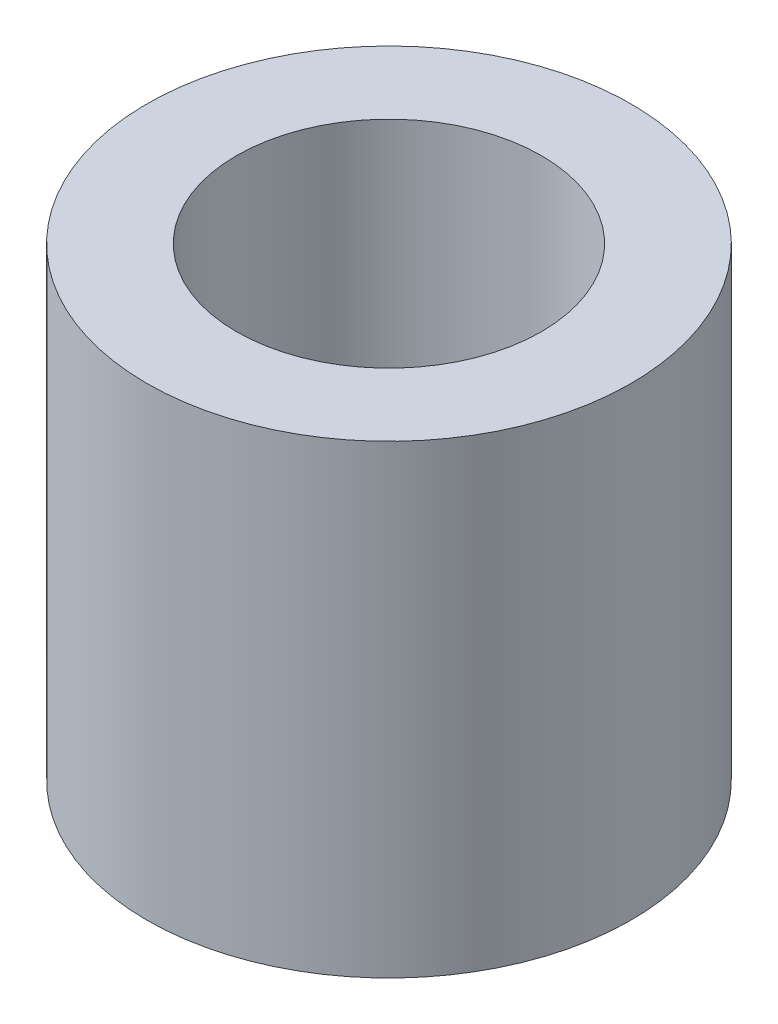
ISO-10303-21;
HEADER;
FILE_DESCRIPTION(('STEP AP214'),'2;1');
FILE_NAME('part.step','',(''),(''),'','','');
FILE_SCHEMA(('AUTOMOTIVE_DESIGN { 1 0 10303 214 1 1 1 1 }'));
ENDSEC;
DATA;
#1=APPLICATION_CONTEXT('core data for automotive mechanical design processes');
#2=APPLICATION_PROTOCOL_DEFINITION('international standard','automotive_design',2000,#1);
#3=PRODUCT_CONTEXT('',#1,'mechanical');
#4=PRODUCT('Part','Part','',(#3));
#5=PRODUCT_RELATED_PRODUCT_CATEGORY('part','',(#4));
#6=PRODUCT_DEFINITION_FORMATION('','',#4);
#7=PRODUCT_DEFINITION_CONTEXT('part definition',#1,'design');
#8=PRODUCT_DEFINITION('design','',#6,#7);
#9=PRODUCT_DEFINITION_SHAPE('','',#8);
#10=(LENGTH_UNIT() NAMED_UNIT(*) SI_UNIT(.MILLI.,.METRE.));
#11=(NAMED_UNIT(*) PLANE_ANGLE_UNIT() SI_UNIT($,.RADIAN.));
#12=(NAMED_UNIT(*) SI_UNIT($,.STERADIAN.) SOLID_ANGLE_UNIT());
#13=UNCERTAINTY_MEASURE_WITH_UNIT(LENGTH_MEASURE(1.E-05),#10,'distance_accuracy_value','');
#14=(GEOMETRIC_REPRESENTATION_CONTEXT(3) GLOBAL_UNCERTAINTY_ASSIGNED_CONTEXT((#13)) GLOBAL_UNIT_ASSIGNED_CONTEXT((#10,
#11,#12)) REPRESENTATION_CONTEXT('',''));
#15=CARTESIAN_POINT('',(0.,0.,0.));
#16=DIRECTION('',(0.,0.,1.));
#17=DIRECTION('',(1.,0.,0.));
#18=AXIS2_PLACEMENT_3D('',#15,#16,#17);
#19=CARTESIAN_POINT('',(0.,-6.096,0.));
#20=DIRECTION('',(0.,1.,0.));
#21=DIRECTION('',(0.,0.,1.));
#22=AXIS2_PLACEMENT_3D('',#19,#20,#21);
#23=CYLINDRICAL_SURFACE('',#22,3.175);
#24=CARTESIAN_POINT('',(0.,-6.096,0.));
#25=DIRECTION('',(0.,1.,0.));
#26=DIRECTION('',(0.,0.,1.));
#27=AXIS2_PLACEMENT_3D('',#24,#25,#26);
#28=CIRCLE('',#27,3.175);
#29=CARTESIAN_POINT('',(0.,-6.096,3.175));
#30=VERTEX_POINT('',#29);
#31=EDGE_CURVE('E10',#30,#30,#28,.T.);
#32=CARTESIAN_POINT('',(0.,0.,0.));
#33=DIRECTION('',(0.,1.,0.));
#34=DIRECTION('',(0.,0.,1.));
#35=AXIS2_PLACEMENT_3D('',#32,#33,#34);
#36=CIRCLE('',#35,3.175);
#37=CARTESIAN_POINT('',(0.,0.,3.175));
#38=VERTEX_POINT('',#37);
#39=EDGE_CURVE('E40',#38,#38,#36,.T.);
#40=CARTESIAN_POINT('',(0.,-6.096,3.175));
#41=CARTESIAN_POINT('',(0.,-6.0325,3.175));
#42=CARTESIAN_POINT('',(0.,-5.969,3.175));
#43=CARTESIAN_POINT('',(0.,-5.842,3.175));
#44=CARTESIAN_POINT('',(0.,-5.7785,3.175));
#45=CARTESIAN_POINT('',(0.,-5.6515,3.175));
#46=CARTESIAN_POINT('',(0.,-5.588,3.175));
#47=CARTESIAN_POINT('',(0.,-5.461,3.175));
#48=CARTESIAN_POINT('',(0.,-5.3975,3.175));
#49=CARTESIAN_POINT('',(0.,-5.2705,3.175));
#50=CARTESIAN_POINT('',(0.,-5.207,3.175));
#51=CARTESIAN_POINT('',(0.,-5.08,3.175));
#52=CARTESIAN_POINT('',(0.,-5.0165,3.175));
#53=CARTESIAN_POINT('',(0.,-4.8895,3.175));
#54=CARTESIAN_POINT('',(0.,-4.826,3.175));
#55=CARTESIAN_POINT('',(0.,-4.699,3.175));
#56=CARTESIAN_POINT('',(0.,-4.6355,3.175));
#57=CARTESIAN_POINT('',(0.,-4.5085,3.175));
#58=CARTESIAN_POINT('',(0.,-4.445,3.175));
#59=CARTESIAN_POINT('',(0.,-4.318,3.175));
#60=CARTESIAN_POINT('',(0.,-4.2545,3.175));
#61=CARTESIAN_POINT('',(0.,-4.1275,3.175));
#62=CARTESIAN_POINT('',(0.,-4.064,3.175));
#63=CARTESIAN_POINT('',(0.,-3.937,3.175));
#64=CARTESIAN_POINT('',(0.,-3.8735,3.175));
#65=CARTESIAN_POINT('',(0.,-3.7465,3.175));
#66=CARTESIAN_POINT('',(0.,-3.683,3.175));
#67=CARTESIAN_POINT('',(0.,-3.556,3.175));
#68=CARTESIAN_POINT('',(0.,-3.4925,3.175));
#69=CARTESIAN_POINT('',(0.,-3.3655,3.175));
#70=CARTESIAN_POINT('',(0.,-3.302,3.175));
#71=CARTESIAN_POINT('',(0.,-3.175,3.175));
#72=CARTESIAN_POINT('',(0.,-3.1115,3.175));
#73=CARTESIAN_POINT('',(0.,-2.9845,3.175));
#74=CARTESIAN_POINT('',(0.,-2.921,3.175));
#75=CARTESIAN_POINT('',(0.,-2.794,3.175));
#76=CARTESIAN_POINT('',(0.,-2.7305,3.175));
#77=CARTESIAN_POINT('',(0.,-2.6035,3.175));
#78=CARTESIAN_POINT('',(0.,-2.54,3.175));
#79=CARTESIAN_POINT('',(0.,-2.413,3.175));
#80=CARTESIAN_POINT('',(0.,-2.3495,3.175));
#81=CARTESIAN_POINT('',(0.,-2.2225,3.175));
#82=CARTESIAN_POINT('',(0.,-2.159,3.175));
#83=CARTESIAN_POINT('',(0.,-2.032,3.175));
#84=CARTESIAN_POINT('',(0.,-1.9685,3.175));
#85=CARTESIAN_POINT('',(0.,-1.8415,3.175));
#86=CARTESIAN_POINT('',(0.,-1.778,3.175));
#87=CARTESIAN_POINT('',(0.,-1.651,3.175));
#88=CARTESIAN_POINT('',(0.,-1.5875,3.175));
#89=CARTESIAN_POINT('',(0.,-1.4605,3.175));
#90=CARTESIAN_POINT('',(0.,-1.397,3.175));
#91=CARTESIAN_POINT('',(0.,-1.27,3.175));
#92=CARTESIAN_POINT('',(0.,-1.2065,3.175));
#93=CARTESIAN_POINT('',(0.,-1.0795,3.175));
#94=CARTESIAN_POINT('',(0.,-1.016,3.175));
#95=CARTESIAN_POINT('',(0.,-0.889,3.175));
#96=CARTESIAN_POINT('',(0.,-0.8255,3.175));
#97=CARTESIAN_POINT('',(0.,-0.6985,3.175));
#98=CARTESIAN_POINT('',(0.,-0.635,3.175));
#99=CARTESIAN_POINT('',(0.,-0.508,3.175));
#100=CARTESIAN_POINT('',(0.,-0.4445,3.175));
#101=CARTESIAN_POINT('',(0.,-0.3175,3.175));
#102=CARTESIAN_POINT('',(0.,-0.254,3.175));
#103=CARTESIAN_POINT('',(0.,-0.127,3.175));
#104=CARTESIAN_POINT('',(0.,-0.0634999999999999,3.175));
#105=CARTESIAN_POINT('',(0.,0.,3.175));
#106=B_SPLINE_CURVE_WITH_KNOTS('',3,(#40,#41,#42,#43,#44,#45,#46,#47,#48,#49,#50,#51,#52,#53,
#54,#55,#56,#57,#58,#59,#60,#61,#62,#63,#64,#65,#66,#67,#68,#69,#70,#71,#72,#73,#74,#75,#76,#77,
#78,#79,#80,#81,#82,#83,#84,#85,#86,#87,#88,#89,#90,#91,#92,#93,#94,#95,#96,#97,#98,#99,#100,
#101,#102,#103,#104,#105),.UNSPECIFIED.,.F.,.F.,(4,2,2,2,2,2,2,2,2,2,2,2,2,2,2,2,2,2,2,2,2,2,2,
2,2,2,2,2,2,2,2,2,4),(0.,0.1905,0.380999999999999,0.5715,0.762,0.952499999999999,1.143,1.3335,
1.524,1.7145,1.905,2.0955,2.286,2.4765,2.667,2.8575,3.048,3.2385,3.429,3.6195,3.81,4.0005,4.191,
4.3815,4.572,4.7625,4.953,5.1435,5.334,5.5245,5.715,5.9055,6.096),.UNSPECIFIED.);
#107=EDGE_CURVE('BSEAM37',#30,#38,#106,.T.);
#108=ORIENTED_EDGE('',*,*,#31,.T.);
#109=ORIENTED_EDGE('',*,*,#39,.F.);
#110=ORIENTED_EDGE('',*,*,#107,.T.);
#111=ORIENTED_EDGE('',*,*,#107,.F.);
#112=EDGE_LOOP('',(#108,#110,#109,#111));
#113=FACE_BOUND('',#112,.T.);
#114=ADVANCED_FACE('F37',(#113),#23,.T.);
#115=CARTESIAN_POINT('',(0.,-6.096,0.));
#116=DIRECTION('',(0.,1.,0.));
#117=DIRECTION('',(0.,0.,1.));
#118=AXIS2_PLACEMENT_3D('',#115,#116,#117);
#119=PLANE('',#118);
#120=CARTESIAN_POINT('',(0.,-6.096,0.));
#121=DIRECTION('',(0.,1.,0.));
#122=DIRECTION('',(0.,0.,1.));
#123=AXIS2_PLACEMENT_3D('',#120,#121,#122);
#124=CIRCLE('',#123,2.);
#125=CARTESIAN_POINT('',(0.,-6.096,2.));
#126=VERTEX_POINT('',#125);
#127=EDGE_CURVE('E49',#126,#126,#124,.T.);
#128=ORIENTED_EDGE('',*,*,#127,.T.);
#129=EDGE_LOOP('',(#128));
#130=FACE_BOUND('',#129,.T.);
#131=ORIENTED_EDGE('',*,*,#31,.F.);
#132=EDGE_LOOP('',(#131));
#133=FACE_BOUND('',#132,.T.);
#134=ADVANCED_FACE('F59',(#130,#133),#119,.F.);
#135=CARTESIAN_POINT('',(0.,0.,0.));
#136=DIRECTION('',(0.,1.,0.));
#137=DIRECTION('',(0.,0.,1.));
#138=AXIS2_PLACEMENT_3D('',#135,#136,#137);
#139=PLANE('',#138);
#140=CARTESIAN_POINT('',(0.,0.,0.));
#141=DIRECTION('',(0.,1.,0.));
#142=DIRECTION('',(0.,0.,1.));
#143=AXIS2_PLACEMENT_3D('',#140,#141,#142);
#144=CIRCLE('',#143,2.);
#145=CARTESIAN_POINT('',(0.,0.,2.));
#146=VERTEX_POINT('',#145);
#147=EDGE_CURVE('E51',#146,#146,#144,.T.);
#148=ORIENTED_EDGE('',*,*,#147,.F.);
#149=EDGE_LOOP('',(#148));
#150=FACE_BOUND('',#149,.T.);
#151=ORIENTED_EDGE('',*,*,#39,.T.);
#152=EDGE_LOOP('',(#151));
#153=FACE_BOUND('',#152,.T.);
#154=ADVANCED_FACE('F65',(#150,#153),#139,.T.);
#155=CARTESIAN_POINT('',(0.,-6.096,0.));
#156=DIRECTION('',(0.,1.,0.));
#157=DIRECTION('',(0.,0.,1.));
#158=AXIS2_PLACEMENT_3D('',#155,#156,#157);
#159=CYLINDRICAL_SURFACE('',#158,2.);
#160=CARTESIAN_POINT('',(0.,-6.096,2.));
#161=CARTESIAN_POINT('',(0.,-6.0325,2.));
#162=CARTESIAN_POINT('',(0.,-5.969,2.));
#163=CARTESIAN_POINT('',(0.,-5.842,2.));
#164=CARTESIAN_POINT('',(0.,-5.7785,2.));
#165=CARTESIAN_POINT('',(0.,-5.6515,2.));
#166=CARTESIAN_POINT('',(0.,-5.588,2.));
#167=CARTESIAN_POINT('',(0.,-5.461,2.));
#168=CARTESIAN_POINT('',(0.,-5.3975,2.));
#169=CARTESIAN_POINT('',(0.,-5.2705,2.));
#170=CARTESIAN_POINT('',(0.,-5.207,2.));
#171=CARTESIAN_POINT('',(0.,-5.08,2.));
#172=CARTESIAN_POINT('',(0.,-5.0165,2.));
#173=CARTESIAN_POINT('',(0.,-4.8895,2.));
#174=CARTESIAN_POINT('',(0.,-4.826,2.));
#175=CARTESIAN_POINT('',(0.,-4.699,2.));
#176=CARTESIAN_POINT('',(0.,-4.6355,2.));
#177=CARTESIAN_POINT('',(0.,-4.5085,2.));
#178=CARTESIAN_POINT('',(0.,-4.445,2.));
#179=CARTESIAN_POINT('',(0.,-4.318,2.));
#180=CARTESIAN_POINT('',(0.,-4.2545,2.));
#181=CARTESIAN_POINT('',(0.,-4.1275,2.));
#182=CARTESIAN_POINT('',(0.,-4.064,2.));
#183=CARTESIAN_POINT('',(0.,-3.937,2.));
#184=CARTESIAN_POINT('',(0.,-3.8735,2.));
#185=CARTESIAN_POINT('',(0.,-3.7465,2.));
#186=CARTESIAN_POINT('',(0.,-3.683,2.));
#187=CARTESIAN_POINT('',(0.,-3.556,2.));
#188=CARTESIAN_POINT('',(0.,-3.4925,2.));
#189=CARTESIAN_POINT('',(0.,-3.3655,2.));
#190=CARTESIAN_POINT('',(0.,-3.302,2.));
#191=CARTESIAN_POINT('',(0.,-3.175,2.));
#192=CARTESIAN_POINT('',(0.,-3.1115,2.));
#193=CARTESIAN_POINT('',(0.,-2.9845,2.));
#194=CARTESIAN_POINT('',(0.,-2.921,2.));
#195=CARTESIAN_POINT('',(0.,-2.794,2.));
#196=CARTESIAN_POINT('',(0.,-2.7305,2.));
#197=CARTESIAN_POINT('',(0.,-2.6035,2.));
#198=CARTESIAN_POINT('',(0.,-2.54,2.));
#199=CARTESIAN_POINT('',(0.,-2.413,2.));
#200=CARTESIAN_POINT('',(0.,-2.3495,2.));
#201=CARTESIAN_POINT('',(0.,-2.2225,2.));
#202=CARTESIAN_POINT('',(0.,-2.159,2.));
#203=CARTESIAN_POINT('',(0.,-2.032,2.));
#204=CARTESIAN_POINT('',(0.,-1.9685,2.));
#205=CARTESIAN_POINT('',(0.,-1.8415,2.));
#206=CARTESIAN_POINT('',(0.,-1.778,2.));
#207=CARTESIAN_POINT('',(0.,-1.651,2.));
#208=CARTESIAN_POINT('',(0.,-1.5875,2.));
#209=CARTESIAN_POINT('',(0.,-1.4605,2.));
#210=CARTESIAN_POINT('',(0.,-1.397,2.));
#211=CARTESIAN_POINT('',(0.,-1.27,2.));
#212=CARTESIAN_POINT('',(0.,-1.2065,2.));
#213=CARTESIAN_POINT('',(0.,-1.0795,2.));
#214=CARTESIAN_POINT('',(0.,-1.016,2.));
#215=CARTESIAN_POINT('',(0.,-0.889,2.));
#216=CARTESIAN_POINT('',(0.,-0.8255,2.));
#217=CARTESIAN_POINT('',(0.,-0.6985,2.));
#218=CARTESIAN_POINT('',(0.,-0.635,2.));
#219=CARTESIAN_POINT('',(0.,-0.508,2.));
#220=CARTESIAN_POINT('',(0.,-0.4445,2.));
#221=CARTESIAN_POINT('',(0.,-0.3175,2.));
#222=CARTESIAN_POINT('',(0.,-0.254,2.));
#223=CARTESIAN_POINT('',(0.,-0.127,2.));
#224=CARTESIAN_POINT('',(0.,-0.0634999999999999,2.));
#225=CARTESIAN_POINT('',(0.,0.,2.));
#226=B_SPLINE_CURVE_WITH_KNOTS('',3,(#160,#161,#162,#163,#164,#165,#166,#167,#168,#169,#170,
#171,#172,#173,#174,#175,#176,#177,#178,#179,#180,#181,#182,#183,#184,#185,#186,#187,#188,#189,
#190,#191,#192,#193,#194,#195,#196,#197,#198,#199,#200,#201,#202,#203,#204,#205,#206,#207,#208,
#209,#210,#211,#212,#213,#214,#215,#216,#217,#218,#219,#220,#221,#222,#223,#224,#225),
.UNSPECIFIED.,.F.,.F.,(4,2,2,2,2,2,2,2,2,2,2,2,2,2,2,2,2,2,2,2,2,2,2,2,2,2,2,2,2,2,2,2,4),(0.,
0.1905,0.380999999999999,0.5715,0.762,0.952499999999999,1.143,1.3335,1.524,1.7145,1.905,2.0955,
2.286,2.4765,2.667,2.8575,3.048,3.2385,3.429,3.6195,3.81,4.0005,4.191,4.3815,4.572,4.7625,4.953,
5.1435,5.334,5.5245,5.715,5.9055,6.096),.UNSPECIFIED.);
#227=EDGE_CURVE('BSEAM62',#126,#146,#226,.T.);
#228=ORIENTED_EDGE('',*,*,#127,.F.);
#229=ORIENTED_EDGE('',*,*,#147,.T.);
#230=ORIENTED_EDGE('',*,*,#227,.T.);
#231=ORIENTED_EDGE('',*,*,#227,.F.);
#232=EDGE_LOOP('',(#228,#230,#229,#231));
#233=FACE_BOUND('',#232,.T.);
#234=ADVANCED_FACE('F62',(#233),#159,.F.);
#235=CLOSED_SHELL('',(#114,#134,#154,#234));
#236=MANIFOLD_SOLID_BREP('B2',#235);
#237=ADVANCED_BREP_SHAPE_REPRESENTATION('',(#18,#236),#14);
#238=SHAPE_DEFINITION_REPRESENTATION(#9,#237);
ENDSEC;
END-ISO-10303-21;
